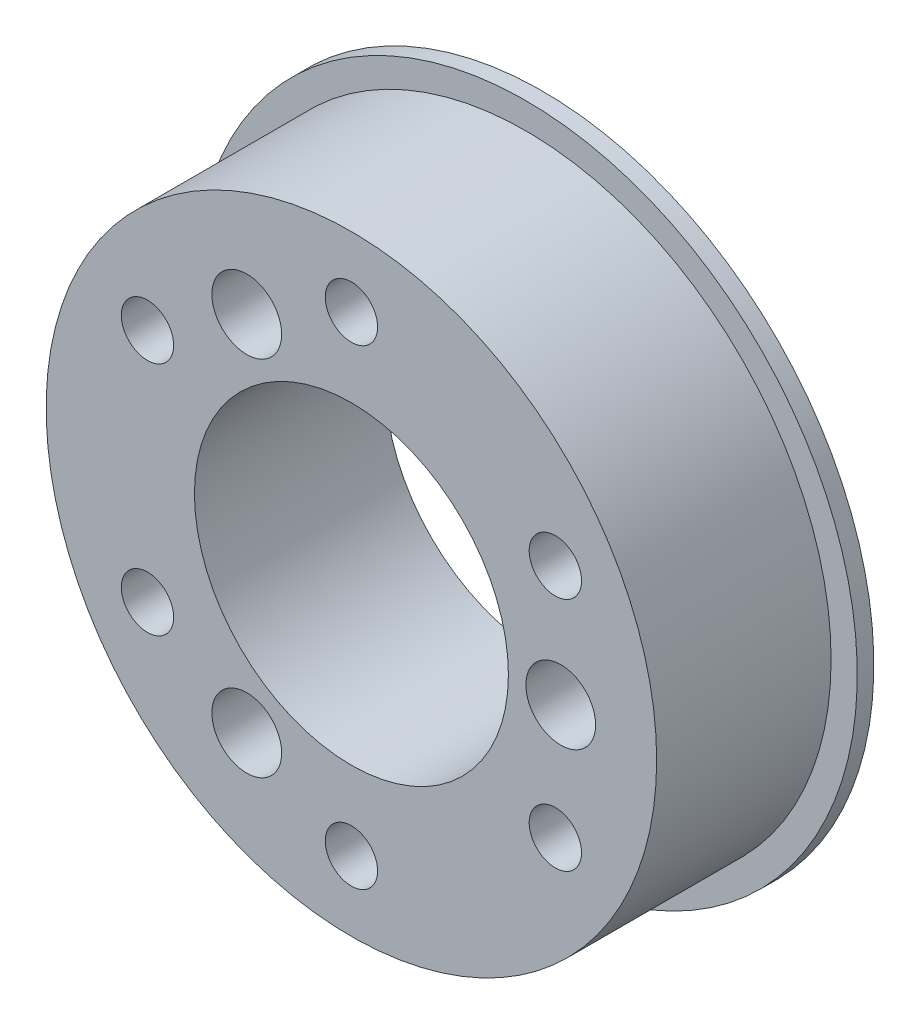
ISO-10303-21;
HEADER;
FILE_DESCRIPTION(('STEP AP214'),'2;1');
FILE_NAME('part.step','',(''),(''),'','','');
FILE_SCHEMA(('AUTOMOTIVE_DESIGN { 1 0 10303 214 1 1 1 1 }'));
ENDSEC;
DATA;
#1=APPLICATION_CONTEXT('core data for automotive mechanical design processes');
#2=APPLICATION_PROTOCOL_DEFINITION('international standard','automotive_design',2000,#1);
#3=PRODUCT_CONTEXT('',#1,'mechanical');
#4=PRODUCT('Part','Part','',(#3));
#5=PRODUCT_RELATED_PRODUCT_CATEGORY('part','',(#4));
#6=PRODUCT_DEFINITION_FORMATION('','',#4);
#7=PRODUCT_DEFINITION_CONTEXT('part definition',#1,'design');
#8=PRODUCT_DEFINITION('design','',#6,#7);
#9=PRODUCT_DEFINITION_SHAPE('','',#8);
#10=(LENGTH_UNIT() NAMED_UNIT(*) SI_UNIT(.MILLI.,.METRE.));
#11=(NAMED_UNIT(*) PLANE_ANGLE_UNIT() SI_UNIT($,.RADIAN.));
#12=(NAMED_UNIT(*) SI_UNIT($,.STERADIAN.) SOLID_ANGLE_UNIT());
#13=UNCERTAINTY_MEASURE_WITH_UNIT(LENGTH_MEASURE(1.E-05),#10,'distance_accuracy_value','');
#14=(GEOMETRIC_REPRESENTATION_CONTEXT(3) GLOBAL_UNCERTAINTY_ASSIGNED_CONTEXT((#13)) GLOBAL_UNIT_ASSIGNED_CONTEXT((#10,
#11,#12)) REPRESENTATION_CONTEXT('',''));
#15=CARTESIAN_POINT('',(0.,0.,0.));
#16=DIRECTION('',(0.,0.,1.));
#17=DIRECTION('',(1.,0.,0.));
#18=AXIS2_PLACEMENT_3D('',#15,#16,#17);
#19=CARTESIAN_POINT('',(0.,0.,10.95));
#20=DIRECTION('',(0.,0.,-1.));
#21=DIRECTION('',(-1.,0.,0.));
#22=AXIS2_PLACEMENT_3D('',#19,#20,#21);
#23=CYLINDRICAL_SURFACE('',#22,17.5);
#24=CARTESIAN_POINT('',(0.,0.,0.95));
#25=DIRECTION('',(0.,0.,1.));
#26=DIRECTION('',(1.,0.,0.));
#27=AXIS2_PLACEMENT_3D('',#24,#25,#26);
#28=CIRCLE('',#27,17.5);
#29=CARTESIAN_POINT('',(17.5,0.,0.95));
#30=VERTEX_POINT('',#29);
#31=EDGE_CURVE('E55',#30,#30,#28,.T.);
#32=ORIENTED_EDGE('',*,*,#31,.T.);
#33=EDGE_LOOP('',(#32));
#34=FACE_BOUND('',#33,.T.);
#35=CARTESIAN_POINT('',(0.,0.,10.95));
#36=DIRECTION('',(0.,0.,1.));
#37=DIRECTION('',(1.,0.,0.));
#38=AXIS2_PLACEMENT_3D('',#35,#36,#37);
#39=CIRCLE('',#38,17.5);
#40=CARTESIAN_POINT('',(17.5,0.,10.95));
#41=VERTEX_POINT('',#40);
#42=EDGE_CURVE('E10',#41,#41,#39,.T.);
#43=ORIENTED_EDGE('',*,*,#42,.F.);
#44=EDGE_LOOP('',(#43));
#45=FACE_BOUND('',#44,.T.);
#46=ADVANCED_FACE('F40',(#34,#45),#23,.T.);
#47=CARTESIAN_POINT('',(0.,0.,10.95));
#48=DIRECTION('',(0.,0.,1.));
#49=DIRECTION('',(1.,0.,0.));
#50=AXIS2_PLACEMENT_3D('',#47,#48,#49);
#51=PLANE('',#50);
#52=CARTESIAN_POINT('',(0.,-13.5,10.95));
#53=DIRECTION('',(0.,0.,1.));
#54=DIRECTION('',(1.,0.,0.));
#55=AXIS2_PLACEMENT_3D('',#52,#53,#54);
#56=CIRCLE('',#55,1.5);
#57=CARTESIAN_POINT('',(1.49999999999991,-13.5,10.95));
#58=VERTEX_POINT('',#57);
#59=EDGE_CURVE('E82',#58,#58,#56,.T.);
#60=ORIENTED_EDGE('',*,*,#59,.F.);
#61=EDGE_LOOP('',(#60));
#62=FACE_BOUND('',#61,.T.);
#63=CARTESIAN_POINT('',(-11.69134295109,-6.74999999999989,10.95));
#64=DIRECTION('',(0.,0.,1.));
#65=DIRECTION('',(1.,0.,0.));
#66=AXIS2_PLACEMENT_3D('',#63,#64,#65);
#67=CIRCLE('',#66,1.5);
#68=CARTESIAN_POINT('',(-10.19134295109,-6.74999999999989,10.95));
#69=VERTEX_POINT('',#68);
#70=EDGE_CURVE('E93',#69,#69,#67,.T.);
#71=ORIENTED_EDGE('',*,*,#70,.F.);
#72=EDGE_LOOP('',(#71));
#73=FACE_BOUND('',#72,.T.);
#74=CARTESIAN_POINT('',(-11.6913429510898,6.75000000000014,10.95));
#75=DIRECTION('',(0.,0.,1.));
#76=DIRECTION('',(1.,0.,0.));
#77=AXIS2_PLACEMENT_3D('',#74,#75,#76);
#78=CIRCLE('',#77,1.5);
#79=CARTESIAN_POINT('',(-10.1913429510898,6.75000000000014,10.95));
#80=VERTEX_POINT('',#79);
#81=EDGE_CURVE('E94',#80,#80,#78,.T.);
#82=ORIENTED_EDGE('',*,*,#81,.F.);
#83=EDGE_LOOP('',(#82));
#84=FACE_BOUND('',#83,.T.);
#85=CARTESIAN_POINT('',(-6.00000000000005,-10.3923048454132,10.95));
#86=DIRECTION('',(0.,0.,1.));
#87=DIRECTION('',(1.,0.,0.));
#88=AXIS2_PLACEMENT_3D('',#85,#86,#87);
#89=CIRCLE('',#88,2.);
#90=CARTESIAN_POINT('',(-4.00000000000005,-10.3923048454132,10.95));
#91=VERTEX_POINT('',#90);
#92=EDGE_CURVE('E105',#91,#91,#89,.T.);
#93=ORIENTED_EDGE('',*,*,#92,.F.);
#94=EDGE_LOOP('',(#93));
#95=FACE_BOUND('',#94,.T.);
#96=CARTESIAN_POINT('',(0.,13.5,10.95));
#97=DIRECTION('',(0.,0.,1.));
#98=DIRECTION('',(1.,0.,0.));
#99=AXIS2_PLACEMENT_3D('',#96,#97,#98);
#100=CIRCLE('',#99,1.5);
#101=CARTESIAN_POINT('',(1.5,13.5,10.95));
#102=VERTEX_POINT('',#101);
#103=EDGE_CURVE('E63',#102,#102,#100,.T.);
#104=ORIENTED_EDGE('',*,*,#103,.F.);
#105=EDGE_LOOP('',(#104));
#106=FACE_BOUND('',#105,.T.);
#107=CARTESIAN_POINT('',(12.,0.,10.95));
#108=DIRECTION('',(0.,0.,1.));
#109=DIRECTION('',(1.,0.,0.));
#110=AXIS2_PLACEMENT_3D('',#107,#108,#109);
#111=CIRCLE('',#110,2.);
#112=CARTESIAN_POINT('',(14.,0.,10.95));
#113=VERTEX_POINT('',#112);
#114=EDGE_CURVE('E69',#113,#113,#111,.T.);
#115=ORIENTED_EDGE('',*,*,#114,.F.);
#116=EDGE_LOOP('',(#115));
#117=FACE_BOUND('',#116,.T.);
#118=CARTESIAN_POINT('',(11.6913429510899,6.74999999999997,10.95));
#119=DIRECTION('',(0.,0.,1.));
#120=DIRECTION('',(1.,0.,0.));
#121=AXIS2_PLACEMENT_3D('',#118,#119,#120);
#122=CIRCLE('',#121,1.5);
#123=CARTESIAN_POINT('',(13.1913429510899,6.74999999999997,10.95));
#124=VERTEX_POINT('',#123);
#125=EDGE_CURVE('E70',#124,#124,#122,.T.);
#126=ORIENTED_EDGE('',*,*,#125,.F.);
#127=EDGE_LOOP('',(#126));
#128=FACE_BOUND('',#127,.T.);
#129=CARTESIAN_POINT('',(11.6913429510899,-6.75000000000005,10.95));
#130=DIRECTION('',(0.,0.,1.));
#131=DIRECTION('',(1.,0.,0.));
#132=AXIS2_PLACEMENT_3D('',#129,#130,#131);
#133=CIRCLE('',#132,1.5);
#134=CARTESIAN_POINT('',(13.1913429510899,-6.75000000000005,10.95));
#135=VERTEX_POINT('',#134);
#136=EDGE_CURVE('E81',#135,#135,#133,.T.);
#137=ORIENTED_EDGE('',*,*,#136,.F.);
#138=EDGE_LOOP('',(#137));
#139=FACE_BOUND('',#138,.T.);
#140=CARTESIAN_POINT('',(-5.99999999999991,10.3923048454133,10.95));
#141=DIRECTION('',(0.,0.,1.));
#142=DIRECTION('',(1.,0.,0.));
#143=AXIS2_PLACEMENT_3D('',#140,#141,#142);
#144=CIRCLE('',#143,2.);
#145=CARTESIAN_POINT('',(-3.99999999999991,10.3923048454133,10.95));
#146=VERTEX_POINT('',#145);
#147=EDGE_CURVE('E106',#146,#146,#144,.T.);
#148=ORIENTED_EDGE('',*,*,#147,.F.);
#149=EDGE_LOOP('',(#148));
#150=FACE_BOUND('',#149,.T.);
#151=CARTESIAN_POINT('',(0.,0.,10.95));
#152=DIRECTION('',(0.,0.,1.));
#153=DIRECTION('',(1.,0.,0.));
#154=AXIS2_PLACEMENT_3D('',#151,#152,#153);
#155=CIRCLE('',#154,9.);
#156=CARTESIAN_POINT('',(9.,0.,10.95));
#157=VERTEX_POINT('',#156);
#158=EDGE_CURVE('E60',#157,#157,#155,.T.);
#159=ORIENTED_EDGE('',*,*,#158,.F.);
#160=EDGE_LOOP('',(#159));
#161=FACE_BOUND('',#160,.T.);
#162=ORIENTED_EDGE('',*,*,#42,.T.);
#163=EDGE_LOOP('',(#162));
#164=FACE_BOUND('',#163,.T.);
#165=ADVANCED_FACE('F122',(#62,#73,#84,#95,#106,#117,#128,#139,#150,#161,#164),#51,.T.);
#166=CARTESIAN_POINT('',(0.,0.,0.95));
#167=DIRECTION('',(0.,0.,1.));
#168=DIRECTION('',(1.,0.,0.));
#169=AXIS2_PLACEMENT_3D('',#166,#167,#168);
#170=PLANE('',#169);
#171=CARTESIAN_POINT('',(0.,0.,0.95));
#172=DIRECTION('',(0.,0.,1.));
#173=DIRECTION('',(1.,0.,0.));
#174=AXIS2_PLACEMENT_3D('',#171,#172,#173);
#175=CIRCLE('',#174,19.);
#176=CARTESIAN_POINT('',(-19.,0.,0.95));
#177=VERTEX_POINT('',#176);
#178=EDGE_CURVE('E46',#177,#177,#175,.T.);
#179=ORIENTED_EDGE('',*,*,#178,.T.);
#180=EDGE_LOOP('',(#179));
#181=FACE_BOUND('',#180,.T.);
#182=ORIENTED_EDGE('',*,*,#31,.F.);
#183=EDGE_LOOP('',(#182));
#184=FACE_BOUND('',#183,.T.);
#185=ADVANCED_FACE('F125',(#181,#184),#170,.T.);
#186=CARTESIAN_POINT('',(0.,0.,0.95));
#187=DIRECTION('',(0.,0.,-1.));
#188=DIRECTION('',(-1.,0.,0.));
#189=AXIS2_PLACEMENT_3D('',#186,#187,#188);
#190=CYLINDRICAL_SURFACE('',#189,19.);
#191=CARTESIAN_POINT('',(0.,0.,0.));
#192=DIRECTION('',(0.,0.,1.));
#193=DIRECTION('',(1.,0.,0.));
#194=AXIS2_PLACEMENT_3D('',#191,#192,#193);
#195=CIRCLE('',#194,19.);
#196=CARTESIAN_POINT('',(-19.,0.,0.));
#197=VERTEX_POINT('',#196);
#198=EDGE_CURVE('E50',#197,#197,#195,.T.);
#199=CARTESIAN_POINT('',(-19.,0.,0.95));
#200=CARTESIAN_POINT('',(-19.,0.,0.940104166666667));
#201=CARTESIAN_POINT('',(-19.,0.,0.930208333333333));
#202=CARTESIAN_POINT('',(-19.,0.,0.910416666666667));
#203=CARTESIAN_POINT('',(-19.,0.,0.900520833333333));
#204=CARTESIAN_POINT('',(-19.,0.,0.880729166666667));
#205=CARTESIAN_POINT('',(-19.,0.,0.870833333333333));
#206=CARTESIAN_POINT('',(-19.,0.,0.851041666666667));
#207=CARTESIAN_POINT('',(-19.,0.,0.841145833333333));
#208=CARTESIAN_POINT('',(-19.,0.,0.821354166666667));
#209=CARTESIAN_POINT('',(-19.,0.,0.811458333333333));
#210=CARTESIAN_POINT('',(-19.,0.,0.791666666666667));
#211=CARTESIAN_POINT('',(-19.,0.,0.781770833333333));
#212=CARTESIAN_POINT('',(-19.,0.,0.761979166666667));
#213=CARTESIAN_POINT('',(-19.,0.,0.752083333333333));
#214=CARTESIAN_POINT('',(-19.,0.,0.732291666666667));
#215=CARTESIAN_POINT('',(-19.,0.,0.722395833333333));
#216=CARTESIAN_POINT('',(-19.,0.,0.702604166666667));
#217=CARTESIAN_POINT('',(-19.,0.,0.692708333333333));
#218=CARTESIAN_POINT('',(-19.,0.,0.672916666666667));
#219=CARTESIAN_POINT('',(-19.,0.,0.663020833333333));
#220=CARTESIAN_POINT('',(-19.,0.,0.643229166666667));
#221=CARTESIAN_POINT('',(-19.,0.,0.633333333333333));
#222=CARTESIAN_POINT('',(-19.,0.,0.613541666666667));
#223=CARTESIAN_POINT('',(-19.,0.,0.603645833333333));
#224=CARTESIAN_POINT('',(-19.,0.,0.583854166666667));
#225=CARTESIAN_POINT('',(-19.,0.,0.573958333333333));
#226=CARTESIAN_POINT('',(-19.,0.,0.554166666666667));
#227=CARTESIAN_POINT('',(-19.,0.,0.544270833333333));
#228=CARTESIAN_POINT('',(-19.,0.,0.524479166666667));
#229=CARTESIAN_POINT('',(-19.,0.,0.514583333333333));
#230=CARTESIAN_POINT('',(-19.,0.,0.494791666666667));
#231=CARTESIAN_POINT('',(-19.,0.,0.484895833333333));
#232=CARTESIAN_POINT('',(-19.,0.,0.465104166666667));
#233=CARTESIAN_POINT('',(-19.,0.,0.455208333333333));
#234=CARTESIAN_POINT('',(-19.,0.,0.435416666666667));
#235=CARTESIAN_POINT('',(-19.,0.,0.425520833333333));
#236=CARTESIAN_POINT('',(-19.,0.,0.405729166666667));
#237=CARTESIAN_POINT('',(-19.,0.,0.395833333333333));
#238=CARTESIAN_POINT('',(-19.,0.,0.376041666666667));
#239=CARTESIAN_POINT('',(-19.,0.,0.366145833333333));
#240=CARTESIAN_POINT('',(-19.,0.,0.346354166666667));
#241=CARTESIAN_POINT('',(-19.,0.,0.336458333333333));
#242=CARTESIAN_POINT('',(-19.,0.,0.316666666666667));
#243=CARTESIAN_POINT('',(-19.,0.,0.306770833333333));
#244=CARTESIAN_POINT('',(-19.,0.,0.286979166666667));
#245=CARTESIAN_POINT('',(-19.,0.,0.277083333333333));
#246=CARTESIAN_POINT('',(-19.,0.,0.257291666666667));
#247=CARTESIAN_POINT('',(-19.,0.,0.247395833333333));
#248=CARTESIAN_POINT('',(-19.,0.,0.227604166666667));
#249=CARTESIAN_POINT('',(-19.,0.,0.217708333333333));
#250=CARTESIAN_POINT('',(-19.,0.,0.197916666666667));
#251=CARTESIAN_POINT('',(-19.,0.,0.188020833333333));
#252=CARTESIAN_POINT('',(-19.,0.,0.168229166666667));
#253=CARTESIAN_POINT('',(-19.,0.,0.158333333333333));
#254=CARTESIAN_POINT('',(-19.,0.,0.138541666666667));
#255=CARTESIAN_POINT('',(-19.,0.,0.128645833333333));
#256=CARTESIAN_POINT('',(-19.,0.,0.108854166666667));
#257=CARTESIAN_POINT('',(-19.,0.,0.0989583333333334));
#258=CARTESIAN_POINT('',(-19.,0.,0.0791666666666667));
#259=CARTESIAN_POINT('',(-19.,0.,0.0692708333333333));
#260=CARTESIAN_POINT('',(-19.,0.,0.0494791666666666));
#261=CARTESIAN_POINT('',(-19.,0.,0.0395833333333333));
#262=CARTESIAN_POINT('',(-19.,0.,0.0197916666666667));
#263=CARTESIAN_POINT('',(-19.,0.,0.00989583333333332));
#264=CARTESIAN_POINT('',(-19.,0.,0.));
#265=B_SPLINE_CURVE_WITH_KNOTS('',3,(#199,#200,#201,#202,#203,#204,#205,#206,#207,#208,#209,
#210,#211,#212,#213,#214,#215,#216,#217,#218,#219,#220,#221,#222,#223,#224,#225,#226,#227,#228,
#229,#230,#231,#232,#233,#234,#235,#236,#237,#238,#239,#240,#241,#242,#243,#244,#245,#246,#247,
#248,#249,#250,#251,#252,#253,#254,#255,#256,#257,#258,#259,#260,#261,#262,#263,#264),
.UNSPECIFIED.,.F.,.F.,(4,2,2,2,2,2,2,2,2,2,2,2,2,2,2,2,2,2,2,2,2,2,2,2,2,2,2,2,2,2,2,2,4),(0.,
0.0296875000000001,0.0593750000000001,0.0890625000000001,0.11875,0.1484375,0.178125,0.2078125,
0.2375,0.2671875,0.296875,0.3265625,0.35625,0.3859375,0.415625,0.4453125,0.475,0.5046875,
0.534375,0.5640625,0.59375,0.6234375,0.653125,0.6828125,0.7125,0.7421875,0.771875,0.8015625,
0.83125,0.8609375,0.890625,0.9203125,0.95),.UNSPECIFIED.);
#266=EDGE_CURVE('BSEAM142',#177,#197,#265,.T.);
#267=ORIENTED_EDGE('',*,*,#178,.F.);
#268=ORIENTED_EDGE('',*,*,#198,.T.);
#269=ORIENTED_EDGE('',*,*,#266,.T.);
#270=ORIENTED_EDGE('',*,*,#266,.F.);
#271=EDGE_LOOP('',(#267,#269,#268,#270));
#272=FACE_BOUND('',#271,.T.);
#273=ADVANCED_FACE('F142',(#272),#190,.T.);
#274=CARTESIAN_POINT('',(0.,0.,0.));
#275=DIRECTION('',(0.,0.,1.));
#276=DIRECTION('',(1.,0.,0.));
#277=AXIS2_PLACEMENT_3D('',#274,#275,#276);
#278=PLANE('',#277);
#279=CARTESIAN_POINT('',(0.,-13.5,0.));
#280=DIRECTION('',(0.,0.,1.));
#281=DIRECTION('',(1.,0.,0.));
#282=AXIS2_PLACEMENT_3D('',#279,#280,#281);
#283=CIRCLE('',#282,1.5);
#284=CARTESIAN_POINT('',(1.49999999999991,-13.5,0.));
#285=VERTEX_POINT('',#284);
#286=EDGE_CURVE('E97',#285,#285,#283,.T.);
#287=ORIENTED_EDGE('',*,*,#286,.T.);
#288=EDGE_LOOP('',(#287));
#289=FACE_BOUND('',#288,.T.);
#290=CARTESIAN_POINT('',(-11.69134295109,-6.74999999999989,0.));
#291=DIRECTION('',(0.,0.,1.));
#292=DIRECTION('',(1.,0.,0.));
#293=AXIS2_PLACEMENT_3D('',#290,#291,#292);
#294=CIRCLE('',#293,1.5);
#295=CARTESIAN_POINT('',(-10.19134295109,-6.74999999999989,0.));
#296=VERTEX_POINT('',#295);
#297=EDGE_CURVE('E90',#296,#296,#294,.T.);
#298=ORIENTED_EDGE('',*,*,#297,.T.);
#299=EDGE_LOOP('',(#298));
#300=FACE_BOUND('',#299,.T.);
#301=CARTESIAN_POINT('',(-11.6913429510898,6.75000000000014,0.));
#302=DIRECTION('',(0.,0.,1.));
#303=DIRECTION('',(1.,0.,0.));
#304=AXIS2_PLACEMENT_3D('',#301,#302,#303);
#305=CIRCLE('',#304,1.5);
#306=CARTESIAN_POINT('',(-10.1913429510898,6.75000000000014,0.));
#307=VERTEX_POINT('',#306);
#308=EDGE_CURVE('E109',#307,#307,#305,.T.);
#309=ORIENTED_EDGE('',*,*,#308,.T.);
#310=EDGE_LOOP('',(#309));
#311=FACE_BOUND('',#310,.T.);
#312=CARTESIAN_POINT('',(-6.00000000000005,-10.3923048454132,0.));
#313=DIRECTION('',(0.,0.,1.));
#314=DIRECTION('',(1.,0.,0.));
#315=AXIS2_PLACEMENT_3D('',#312,#313,#314);
#316=CIRCLE('',#315,2.);
#317=CARTESIAN_POINT('',(-4.00000000000005,-10.3923048454132,0.));
#318=VERTEX_POINT('',#317);
#319=EDGE_CURVE('E102',#318,#318,#316,.T.);
#320=ORIENTED_EDGE('',*,*,#319,.T.);
#321=EDGE_LOOP('',(#320));
#322=FACE_BOUND('',#321,.T.);
#323=CARTESIAN_POINT('',(0.,13.5,0.));
#324=DIRECTION('',(0.,0.,1.));
#325=DIRECTION('',(1.,0.,0.));
#326=AXIS2_PLACEMENT_3D('',#323,#324,#325);
#327=CIRCLE('',#326,1.5);
#328=CARTESIAN_POINT('',(1.5,13.5,0.));
#329=VERTEX_POINT('',#328);
#330=EDGE_CURVE('E73',#329,#329,#327,.T.);
#331=ORIENTED_EDGE('',*,*,#330,.T.);
#332=EDGE_LOOP('',(#331));
#333=FACE_BOUND('',#332,.T.);
#334=CARTESIAN_POINT('',(12.,0.,0.));
#335=DIRECTION('',(0.,0.,1.));
#336=DIRECTION('',(1.,0.,0.));
#337=AXIS2_PLACEMENT_3D('',#334,#335,#336);
#338=CIRCLE('',#337,2.);
#339=CARTESIAN_POINT('',(14.,0.,0.));
#340=VERTEX_POINT('',#339);
#341=EDGE_CURVE('E66',#340,#340,#338,.T.);
#342=ORIENTED_EDGE('',*,*,#341,.T.);
#343=EDGE_LOOP('',(#342));
#344=FACE_BOUND('',#343,.T.);
#345=CARTESIAN_POINT('',(11.6913429510899,6.74999999999997,0.));
#346=DIRECTION('',(0.,0.,1.));
#347=DIRECTION('',(1.,0.,0.));
#348=AXIS2_PLACEMENT_3D('',#345,#346,#347);
#349=CIRCLE('',#348,1.5);
#350=CARTESIAN_POINT('',(13.1913429510899,6.74999999999997,0.));
#351=VERTEX_POINT('',#350);
#352=EDGE_CURVE('E85',#351,#351,#349,.T.);
#353=ORIENTED_EDGE('',*,*,#352,.T.);
#354=EDGE_LOOP('',(#353));
#355=FACE_BOUND('',#354,.T.);
#356=CARTESIAN_POINT('',(11.6913429510899,-6.75000000000005,0.));
#357=DIRECTION('',(0.,0.,1.));
#358=DIRECTION('',(1.,0.,0.));
#359=AXIS2_PLACEMENT_3D('',#356,#357,#358);
#360=CIRCLE('',#359,1.5);
#361=CARTESIAN_POINT('',(13.1913429510899,-6.75000000000005,0.));
#362=VERTEX_POINT('',#361);
#363=EDGE_CURVE('E78',#362,#362,#360,.T.);
#364=ORIENTED_EDGE('',*,*,#363,.T.);
#365=EDGE_LOOP('',(#364));
#366=FACE_BOUND('',#365,.T.);
#367=CARTESIAN_POINT('',(-5.99999999999991,10.3923048454133,0.));
#368=DIRECTION('',(0.,0.,1.));
#369=DIRECTION('',(1.,0.,0.));
#370=AXIS2_PLACEMENT_3D('',#367,#368,#369);
#371=CIRCLE('',#370,2.);
#372=CARTESIAN_POINT('',(-3.99999999999991,10.3923048454133,0.));
#373=VERTEX_POINT('',#372);
#374=EDGE_CURVE('E114',#373,#373,#371,.T.);
#375=ORIENTED_EDGE('',*,*,#374,.T.);
#376=EDGE_LOOP('',(#375));
#377=FACE_BOUND('',#376,.T.);
#378=CARTESIAN_POINT('',(0.,0.,0.));
#379=DIRECTION('',(0.,0.,1.));
#380=DIRECTION('',(1.,0.,0.));
#381=AXIS2_PLACEMENT_3D('',#378,#379,#380);
#382=CIRCLE('',#381,9.);
#383=CARTESIAN_POINT('',(9.,0.,0.));
#384=VERTEX_POINT('',#383);
#385=EDGE_CURVE('E59',#384,#384,#382,.T.);
#386=ORIENTED_EDGE('',*,*,#385,.T.);
#387=EDGE_LOOP('',(#386));
#388=FACE_BOUND('',#387,.T.);
#389=ORIENTED_EDGE('',*,*,#198,.F.);
#390=EDGE_LOOP('',(#389));
#391=FACE_BOUND('',#390,.T.);
#392=ADVANCED_FACE('F132',(#289,#300,#311,#322,#333,#344,#355,#366,#377,#388,#391),#278,.F.);
#393=CARTESIAN_POINT('',(0.,0.,0.));
#394=DIRECTION('',(0.,0.,1.));
#395=DIRECTION('',(1.,0.,0.));
#396=AXIS2_PLACEMENT_3D('',#393,#394,#395);
#397=CYLINDRICAL_SURFACE('',#396,9.);
#398=ORIENTED_EDGE('',*,*,#385,.F.);
#399=EDGE_LOOP('',(#398));
#400=FACE_BOUND('',#399,.T.);
#401=ORIENTED_EDGE('',*,*,#158,.T.);
#402=EDGE_LOOP('',(#401));
#403=FACE_BOUND('',#402,.T.);
#404=ADVANCED_FACE('F130',(#400,#403),#397,.F.);
#405=CARTESIAN_POINT('',(-5.99999999999991,10.3923048454133,0.));
#406=DIRECTION('',(0.,0.,1.));
#407=DIRECTION('',(1.,0.,0.));
#408=AXIS2_PLACEMENT_3D('',#405,#406,#407);
#409=CYLINDRICAL_SURFACE('',#408,2.);
#410=ORIENTED_EDGE('',*,*,#374,.F.);
#411=EDGE_LOOP('',(#410));
#412=FACE_BOUND('',#411,.T.);
#413=ORIENTED_EDGE('',*,*,#147,.T.);
#414=EDGE_LOOP('',(#413));
#415=FACE_BOUND('',#414,.T.);
#416=ADVANCED_FACE('F120',(#412,#415),#409,.F.);
#417=CARTESIAN_POINT('',(11.6913429510899,-6.75000000000005,0.));
#418=DIRECTION('',(0.,0.,1.));
#419=DIRECTION('',(1.,0.,0.));
#420=AXIS2_PLACEMENT_3D('',#417,#418,#419);
#421=CYLINDRICAL_SURFACE('',#420,1.5);
#422=ORIENTED_EDGE('',*,*,#363,.F.);
#423=EDGE_LOOP('',(#422));
#424=FACE_BOUND('',#423,.T.);
#425=ORIENTED_EDGE('',*,*,#136,.T.);
#426=EDGE_LOOP('',(#425));
#427=FACE_BOUND('',#426,.T.);
#428=ADVANCED_FACE('F139',(#424,#427),#421,.F.);
#429=CARTESIAN_POINT('',(11.6913429510899,6.74999999999997,0.));
#430=DIRECTION('',(0.,0.,1.));
#431=DIRECTION('',(1.,0.,0.));
#432=AXIS2_PLACEMENT_3D('',#429,#430,#431);
#433=CYLINDRICAL_SURFACE('',#432,1.5);
#434=ORIENTED_EDGE('',*,*,#352,.F.);
#435=EDGE_LOOP('',(#434));
#436=FACE_BOUND('',#435,.T.);
#437=ORIENTED_EDGE('',*,*,#125,.T.);
#438=EDGE_LOOP('',(#437));
#439=FACE_BOUND('',#438,.T.);
#440=ADVANCED_FACE('F197',(#436,#439),#433,.F.);
#441=CARTESIAN_POINT('',(12.,0.,0.));
#442=DIRECTION('',(0.,0.,1.));
#443=DIRECTION('',(1.,0.,0.));
#444=AXIS2_PLACEMENT_3D('',#441,#442,#443);
#445=CYLINDRICAL_SURFACE('',#444,2.);
#446=ORIENTED_EDGE('',*,*,#341,.F.);
#447=EDGE_LOOP('',(#446));
#448=FACE_BOUND('',#447,.T.);
#449=ORIENTED_EDGE('',*,*,#114,.T.);
#450=EDGE_LOOP('',(#449));
#451=FACE_BOUND('',#450,.T.);
#452=ADVANCED_FACE('F207',(#448,#451),#445,.F.);
#453=CARTESIAN_POINT('',(0.,13.5,0.));
#454=DIRECTION('',(0.,0.,1.));
#455=DIRECTION('',(1.,0.,0.));
#456=AXIS2_PLACEMENT_3D('',#453,#454,#455);
#457=CYLINDRICAL_SURFACE('',#456,1.5);
#458=ORIENTED_EDGE('',*,*,#330,.F.);
#459=EDGE_LOOP('',(#458));
#460=FACE_BOUND('',#459,.T.);
#461=ORIENTED_EDGE('',*,*,#103,.T.);
#462=EDGE_LOOP('',(#461));
#463=FACE_BOUND('',#462,.T.);
#464=ADVANCED_FACE('F217',(#460,#463),#457,.F.);
#465=CARTESIAN_POINT('',(-6.00000000000005,-10.3923048454132,0.));
#466=DIRECTION('',(0.,0.,1.));
#467=DIRECTION('',(1.,0.,0.));
#468=AXIS2_PLACEMENT_3D('',#465,#466,#467);
#469=CYLINDRICAL_SURFACE('',#468,2.);
#470=ORIENTED_EDGE('',*,*,#319,.F.);
#471=EDGE_LOOP('',(#470));
#472=FACE_BOUND('',#471,.T.);
#473=ORIENTED_EDGE('',*,*,#92,.T.);
#474=EDGE_LOOP('',(#473));
#475=FACE_BOUND('',#474,.T.);
#476=ADVANCED_FACE('F226',(#472,#475),#469,.F.);
#477=CARTESIAN_POINT('',(-11.6913429510898,6.75000000000014,0.));
#478=DIRECTION('',(0.,0.,1.));
#479=DIRECTION('',(1.,0.,0.));
#480=AXIS2_PLACEMENT_3D('',#477,#478,#479);
#481=CYLINDRICAL_SURFACE('',#480,1.5);
#482=ORIENTED_EDGE('',*,*,#308,.F.);
#483=EDGE_LOOP('',(#482));
#484=FACE_BOUND('',#483,.T.);
#485=ORIENTED_EDGE('',*,*,#81,.T.);
#486=EDGE_LOOP('',(#485));
#487=FACE_BOUND('',#486,.T.);
#488=ADVANCED_FACE('F236',(#484,#487),#481,.F.);
#489=CARTESIAN_POINT('',(-11.69134295109,-6.74999999999989,0.));
#490=DIRECTION('',(0.,0.,1.));
#491=DIRECTION('',(1.,0.,0.));
#492=AXIS2_PLACEMENT_3D('',#489,#490,#491);
#493=CYLINDRICAL_SURFACE('',#492,1.5);
#494=ORIENTED_EDGE('',*,*,#297,.F.);
#495=EDGE_LOOP('',(#494));
#496=FACE_BOUND('',#495,.T.);
#497=ORIENTED_EDGE('',*,*,#70,.T.);
#498=EDGE_LOOP('',(#497));
#499=FACE_BOUND('',#498,.T.);
#500=ADVANCED_FACE('F246',(#496,#499),#493,.F.);
#501=CARTESIAN_POINT('',(0.,-13.5,0.));
#502=DIRECTION('',(0.,0.,1.));
#503=DIRECTION('',(1.,0.,0.));
#504=AXIS2_PLACEMENT_3D('',#501,#502,#503);
#505=CYLINDRICAL_SURFACE('',#504,1.5);
#506=ORIENTED_EDGE('',*,*,#286,.F.);
#507=EDGE_LOOP('',(#506));
#508=FACE_BOUND('',#507,.T.);
#509=ORIENTED_EDGE('',*,*,#59,.T.);
#510=EDGE_LOOP('',(#509));
#511=FACE_BOUND('',#510,.T.);
#512=ADVANCED_FACE('F256',(#508,#511),#505,.F.);
#513=CLOSED_SHELL('',(#46,#165,#185,#273,#392,#404,#416,#428,#440,#452,#464,#476,#488,#500,#512));
#514=MANIFOLD_SOLID_BREP('B2',#513);
#515=ADVANCED_BREP_SHAPE_REPRESENTATION('',(#18,#514),#14);
#516=SHAPE_DEFINITION_REPRESENTATION(#9,#515);
ENDSEC;
END-ISO-10303-21;
